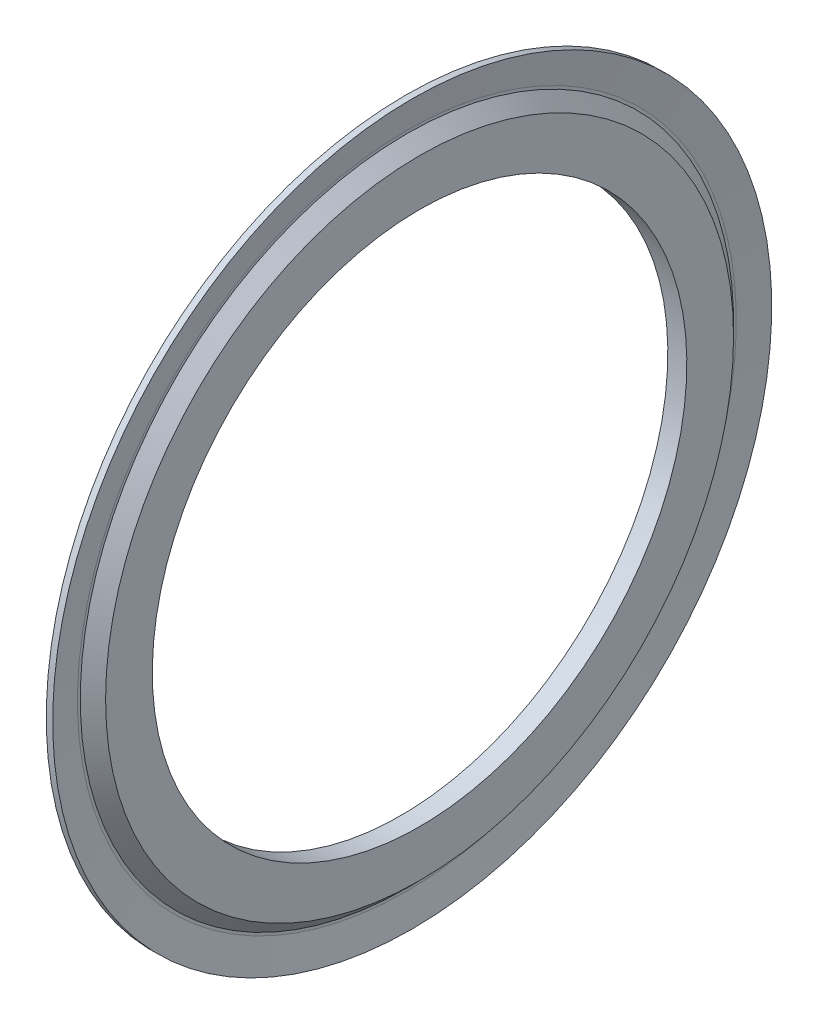
ISO-10303-21;
HEADER;
FILE_DESCRIPTION(('STEP AP214'),'2;1');
FILE_NAME('part.step','',(''),(''),'','','');
FILE_SCHEMA(('AUTOMOTIVE_DESIGN { 1 0 10303 214 1 1 1 1 }'));
ENDSEC;
DATA;
#1=APPLICATION_CONTEXT('core data for automotive mechanical design processes');
#2=APPLICATION_PROTOCOL_DEFINITION('international standard','automotive_design',2000,#1);
#3=PRODUCT_CONTEXT('',#1,'mechanical');
#4=PRODUCT('Part','Part','',(#3));
#5=PRODUCT_RELATED_PRODUCT_CATEGORY('part','',(#4));
#6=PRODUCT_DEFINITION_FORMATION('','',#4);
#7=PRODUCT_DEFINITION_CONTEXT('part definition',#1,'design');
#8=PRODUCT_DEFINITION('design','',#6,#7);
#9=PRODUCT_DEFINITION_SHAPE('','',#8);
#10=(LENGTH_UNIT() NAMED_UNIT(*) SI_UNIT(.MILLI.,.METRE.));
#11=(NAMED_UNIT(*) PLANE_ANGLE_UNIT() SI_UNIT($,.RADIAN.));
#12=(NAMED_UNIT(*) SI_UNIT($,.STERADIAN.) SOLID_ANGLE_UNIT());
#13=UNCERTAINTY_MEASURE_WITH_UNIT(LENGTH_MEASURE(1.E-05),#10,'distance_accuracy_value','');
#14=(GEOMETRIC_REPRESENTATION_CONTEXT(3) GLOBAL_UNCERTAINTY_ASSIGNED_CONTEXT((#13)) GLOBAL_UNIT_ASSIGNED_CONTEXT((#10,
#11,#12)) REPRESENTATION_CONTEXT('',''));
#15=CARTESIAN_POINT('',(0.,0.,0.));
#16=DIRECTION('',(0.,0.,1.));
#17=DIRECTION('',(1.,0.,0.));
#18=AXIS2_PLACEMENT_3D('',#15,#16,#17);
#19=CARTESIAN_POINT('',(2.67137851025326,4.335625,0.));
#20=DIRECTION('',(-1.,0.,0.));
#21=DIRECTION('',(0.,-1.,0.));
#22=AXIS2_PLACEMENT_3D('',#19,#20,#21);
#23=PLANE('',#22);
#24=CARTESIAN_POINT('',(2.67137851025326,0.,0.));
#25=DIRECTION('',(-1.,0.,0.));
#26=DIRECTION('',(0.,1.,0.));
#27=AXIS2_PLACEMENT_3D('',#24,#25,#26);
#28=CIRCLE('',#27,4.29625);
#29=CARTESIAN_POINT('',(2.67137851025326,4.29625,0.));
#30=VERTEX_POINT('',#29);
#31=EDGE_CURVE('E11',#30,#30,#28,.T.);
#32=ORIENTED_EDGE('',*,*,#31,.F.);
#33=EDGE_LOOP('',(#32));
#34=FACE_BOUND('',#33,.T.);
#35=CARTESIAN_POINT('',(2.67137851025326,0.,0.));
#36=DIRECTION('',(-1.,0.,0.));
#37=DIRECTION('',(0.,1.,0.));
#38=AXIS2_PLACEMENT_3D('',#35,#36,#37);
#39=CIRCLE('',#38,4.375);
#40=CARTESIAN_POINT('',(2.67137851025326,4.375,0.));
#41=VERTEX_POINT('',#40);
#42=EDGE_CURVE('E90',#41,#41,#39,.T.);
#43=ORIENTED_EDGE('',*,*,#42,.T.);
#44=EDGE_LOOP('',(#43));
#45=FACE_BOUND('',#44,.T.);
#46=ADVANCED_FACE('F37',(#34,#45),#23,.T.);
#47=CARTESIAN_POINT('',(2.75537851025326,0.,0.));
#48=DIRECTION('',(-1.,0.,0.));
#49=DIRECTION('',(0.,1.,0.));
#50=AXIS2_PLACEMENT_3D('',#47,#48,#49);
#51=CONICAL_SURFACE('',#50,4.21225,0.785398163397449);
#52=CARTESIAN_POINT('',(2.83937851025326,0.,0.));
#53=DIRECTION('',(-1.,0.,0.));
#54=DIRECTION('',(0.,1.,0.));
#55=AXIS2_PLACEMENT_3D('',#52,#53,#54);
#56=CIRCLE('',#55,4.12825);
#57=CARTESIAN_POINT('',(2.83937851025326,4.12825,0.));
#58=VERTEX_POINT('',#57);
#59=EDGE_CURVE('E47',#58,#58,#56,.T.);
#60=ORIENTED_EDGE('',*,*,#59,.F.);
#61=EDGE_LOOP('',(#60));
#62=FACE_BOUND('',#61,.T.);
#63=ORIENTED_EDGE('',*,*,#31,.T.);
#64=EDGE_LOOP('',(#63));
#65=FACE_BOUND('',#64,.T.);
#66=ADVANCED_FACE('F39',(#62,#65),#51,.F.);
#67=CARTESIAN_POINT('',(2.83937851025326,3.878,0.));
#68=DIRECTION('',(-1.,0.,0.));
#69=DIRECTION('',(0.,-1.,0.));
#70=AXIS2_PLACEMENT_3D('',#67,#68,#69);
#71=PLANE('',#70);
#72=CARTESIAN_POINT('',(2.83937851025326,0.,0.));
#73=DIRECTION('',(-1.,0.,0.));
#74=DIRECTION('',(0.,1.,0.));
#75=AXIS2_PLACEMENT_3D('',#72,#73,#74);
#76=CIRCLE('',#75,3.62775);
#77=CARTESIAN_POINT('',(2.83937851025326,3.62775,0.));
#78=VERTEX_POINT('',#77);
#79=EDGE_CURVE('E102',#78,#78,#76,.T.);
#80=ORIENTED_EDGE('',*,*,#79,.F.);
#81=EDGE_LOOP('',(#80));
#82=FACE_BOUND('',#81,.T.);
#83=ORIENTED_EDGE('',*,*,#59,.T.);
#84=EDGE_LOOP('',(#83));
#85=FACE_BOUND('',#84,.T.);
#86=ADVANCED_FACE('F134',(#82,#85),#71,.T.);
#87=CARTESIAN_POINT('',(2.75537851025326,0.,0.));
#88=DIRECTION('',(-1.,0.,0.));
#89=DIRECTION('',(0.,1.,0.));
#90=AXIS2_PLACEMENT_3D('',#87,#88,#89);
#91=CYLINDRICAL_SURFACE('',#90,3.62775);
#92=CARTESIAN_POINT('',(2.67137851025326,0.,0.));
#93=DIRECTION('',(-1.,0.,0.));
#94=DIRECTION('',(0.,1.,0.));
#95=AXIS2_PLACEMENT_3D('',#92,#93,#94);
#96=CIRCLE('',#95,3.62775);
#97=CARTESIAN_POINT('',(2.67137851025326,3.62775,0.));
#98=VERTEX_POINT('',#97);
#99=EDGE_CURVE('E103',#98,#98,#96,.T.);
#100=ORIENTED_EDGE('',*,*,#99,.F.);
#101=EDGE_LOOP('',(#100));
#102=FACE_BOUND('',#101,.T.);
#103=ORIENTED_EDGE('',*,*,#79,.T.);
#104=EDGE_LOOP('',(#103));
#105=FACE_BOUND('',#104,.T.);
#106=ADVANCED_FACE('F152',(#102,#105),#91,.T.);
#107=CARTESIAN_POINT('',(2.67137851025326,3.58575,0.));
#108=DIRECTION('',(-1.,0.,0.));
#109=DIRECTION('',(0.,-1.,0.));
#110=AXIS2_PLACEMENT_3D('',#107,#108,#109);
#111=PLANE('',#110);
#112=CARTESIAN_POINT('',(2.67137851025326,0.,0.));
#113=DIRECTION('',(-1.,0.,0.));
#114=DIRECTION('',(0.,1.,0.));
#115=AXIS2_PLACEMENT_3D('',#112,#113,#114);
#116=CIRCLE('',#115,3.54375);
#117=CARTESIAN_POINT('',(2.67137851025326,3.54375,0.));
#118=VERTEX_POINT('',#117);
#119=EDGE_CURVE('E106',#118,#118,#116,.T.);
#120=ORIENTED_EDGE('',*,*,#119,.F.);
#121=EDGE_LOOP('',(#120));
#122=FACE_BOUND('',#121,.T.);
#123=ORIENTED_EDGE('',*,*,#99,.T.);
#124=EDGE_LOOP('',(#123));
#125=FACE_BOUND('',#124,.T.);
#126=ADVANCED_FACE('F143',(#122,#125),#111,.T.);
#127=CARTESIAN_POINT('',(2.79737851025326,0.,0.));
#128=DIRECTION('',(-1.,0.,0.));
#129=DIRECTION('',(0.,1.,0.));
#130=AXIS2_PLACEMENT_3D('',#127,#128,#129);
#131=CYLINDRICAL_SURFACE('',#130,3.54375);
#132=CARTESIAN_POINT('',(2.92337851025326,0.,0.));
#133=DIRECTION('',(-1.,0.,0.));
#134=DIRECTION('',(0.,1.,0.));
#135=AXIS2_PLACEMENT_3D('',#132,#133,#134);
#136=CIRCLE('',#135,3.54375);
#137=CARTESIAN_POINT('',(2.92337851025326,3.54375,0.));
#138=VERTEX_POINT('',#137);
#139=EDGE_CURVE('E41',#138,#138,#136,.T.);
#140=ORIENTED_EDGE('',*,*,#139,.F.);
#141=EDGE_LOOP('',(#140));
#142=FACE_BOUND('',#141,.T.);
#143=ORIENTED_EDGE('',*,*,#119,.T.);
#144=EDGE_LOOP('',(#143));
#145=FACE_BOUND('',#144,.T.);
#146=ADVANCED_FACE('F138',(#142,#145),#131,.F.);
#147=CARTESIAN_POINT('',(2.92337851025326,3.85339696961967,0.));
#148=DIRECTION('',(1.,0.,0.));
#149=DIRECTION('',(0.,1.,0.));
#150=AXIS2_PLACEMENT_3D('',#147,#148,#149);
#151=PLANE('',#150);
#152=CARTESIAN_POINT('',(2.92337851025326,0.,0.));
#153=DIRECTION('',(-1.,0.,0.));
#154=DIRECTION('',(0.,1.,0.));
#155=AXIS2_PLACEMENT_3D('',#152,#153,#154);
#156=CIRCLE('',#155,4.16304393923934);
#157=CARTESIAN_POINT('',(2.92337851025326,4.16304393923934,0.));
#158=VERTEX_POINT('',#157);
#159=EDGE_CURVE('E64',#158,#158,#156,.T.);
#160=ORIENTED_EDGE('',*,*,#159,.F.);
#161=EDGE_LOOP('',(#160));
#162=FACE_BOUND('',#161,.T.);
#163=ORIENTED_EDGE('',*,*,#139,.T.);
#164=EDGE_LOOP('',(#163));
#165=FACE_BOUND('',#164,.T.);
#166=ADVANCED_FACE('F125',(#162,#165),#151,.T.);
#167=CARTESIAN_POINT('',(2.83937851025326,0.,0.));
#168=DIRECTION('',(-1.,0.,0.));
#169=DIRECTION('',(0.,1.,0.));
#170=AXIS2_PLACEMENT_3D('',#167,#168,#169);
#171=CONICAL_SURFACE('',#170,4.24704393923934,0.785398163397446);
#172=CARTESIAN_POINT('',(2.75537851025326,0.,0.));
#173=DIRECTION('',(-1.,0.,0.));
#174=DIRECTION('',(0.,1.,0.));
#175=AXIS2_PLACEMENT_3D('',#172,#173,#174);
#176=CIRCLE('',#175,4.33104393923934);
#177=CARTESIAN_POINT('',(2.75537851025326,4.33104393923934,0.));
#178=VERTEX_POINT('',#177);
#179=EDGE_CURVE('E70',#178,#178,#176,.T.);
#180=ORIENTED_EDGE('',*,*,#179,.F.);
#181=EDGE_LOOP('',(#180));
#182=FACE_BOUND('',#181,.T.);
#183=ORIENTED_EDGE('',*,*,#159,.T.);
#184=EDGE_LOOP('',(#183));
#185=FACE_BOUND('',#184,.T.);
#186=ADVANCED_FACE('F117',(#182,#185),#171,.T.);
#187=CARTESIAN_POINT('',(2.75537851025326,4.34934744575158,0.));
#188=DIRECTION('',(1.,0.,0.));
#189=DIRECTION('',(0.,1.,0.));
#190=AXIS2_PLACEMENT_3D('',#187,#188,#189);
#191=PLANE('',#190);
#192=CARTESIAN_POINT('',(2.75537851025326,0.,0.));
#193=DIRECTION('',(-1.,0.,0.));
#194=DIRECTION('',(0.,1.,0.));
#195=AXIS2_PLACEMENT_3D('',#192,#193,#194);
#196=CIRCLE('',#195,4.36765095226383);
#197=CARTESIAN_POINT('',(2.75537851025326,4.36765095226383,0.));
#198=VERTEX_POINT('',#197);
#199=EDGE_CURVE('E95',#198,#198,#196,.T.);
#200=ORIENTED_EDGE('',*,*,#199,.F.);
#201=EDGE_LOOP('',(#200));
#202=FACE_BOUND('',#201,.T.);
#203=ORIENTED_EDGE('',*,*,#179,.T.);
#204=EDGE_LOOP('',(#203));
#205=FACE_BOUND('',#204,.T.);
#206=ADVANCED_FACE('F115',(#202,#205),#191,.T.);
#207=CARTESIAN_POINT('',(2.79058651617132,0.,0.));
#208=DIRECTION('',(1.,0.,0.));
#209=DIRECTION('',(0.,1.,0.));
#210=AXIS2_PLACEMENT_3D('',#207,#208,#209);
#211=CONICAL_SURFACE('',#210,4.56732547613191,1.39626340159546);
#212=CARTESIAN_POINT('',(2.82579452208938,0.,0.));
#213=DIRECTION('',(-1.,0.,0.));
#214=DIRECTION('',(0.,1.,0.));
#215=AXIS2_PLACEMENT_3D('',#212,#213,#214);
#216=CIRCLE('',#215,4.767);
#217=CARTESIAN_POINT('',(2.82579452208938,4.767,0.));
#218=VERTEX_POINT('',#217);
#219=EDGE_CURVE('E92',#218,#218,#216,.T.);
#220=ORIENTED_EDGE('',*,*,#219,.F.);
#221=EDGE_LOOP('',(#220));
#222=FACE_BOUND('',#221,.T.);
#223=ORIENTED_EDGE('',*,*,#199,.T.);
#224=EDGE_LOOP('',(#223));
#225=FACE_BOUND('',#224,.T.);
#226=ADVANCED_FACE('F113',(#222,#225),#211,.F.);
#227=CARTESIAN_POINT('',(2.78314660439018,0.,0.));
#228=DIRECTION('',(-1.,0.,0.));
#229=DIRECTION('',(0.,1.,0.));
#230=AXIS2_PLACEMENT_3D('',#227,#228,#229);
#231=CYLINDRICAL_SURFACE('',#230,4.767);
#232=CARTESIAN_POINT('',(2.74049868669098,0.,0.));
#233=DIRECTION('',(-1.,0.,0.));
#234=DIRECTION('',(0.,1.,0.));
#235=AXIS2_PLACEMENT_3D('',#232,#233,#234);
#236=CIRCLE('',#235,4.767);
#237=CARTESIAN_POINT('',(2.74049868669098,4.767,0.));
#238=VERTEX_POINT('',#237);
#239=EDGE_CURVE('E93',#238,#238,#236,.T.);
#240=ORIENTED_EDGE('',*,*,#239,.F.);
#241=EDGE_LOOP('',(#240));
#242=FACE_BOUND('',#241,.T.);
#243=ORIENTED_EDGE('',*,*,#219,.T.);
#244=EDGE_LOOP('',(#243));
#245=FACE_BOUND('',#244,.T.);
#246=ADVANCED_FACE('F123',(#242,#245),#231,.T.);
#247=CARTESIAN_POINT('',(2.70593859847212,0.,0.));
#248=DIRECTION('',(1.,0.,0.));
#249=DIRECTION('',(0.,1.,0.));
#250=AXIS2_PLACEMENT_3D('',#247,#248,#249);
#251=CONICAL_SURFACE('',#250,4.571,1.39626340159546);
#252=ORIENTED_EDGE('',*,*,#42,.F.);
#253=EDGE_LOOP('',(#252));
#254=FACE_BOUND('',#253,.T.);
#255=ORIENTED_EDGE('',*,*,#239,.T.);
#256=EDGE_LOOP('',(#255));
#257=FACE_BOUND('',#256,.T.);
#258=ADVANCED_FACE('F163',(#254,#257),#251,.T.);
#259=CLOSED_SHELL('',(#46,#66,#86,#106,#126,#146,#166,#186,#206,#226,#246,#258));
#260=MANIFOLD_SOLID_BREP('B2',#259);
#261=ADVANCED_BREP_SHAPE_REPRESENTATION('',(#18,#260),#14);
#262=SHAPE_DEFINITION_REPRESENTATION(#9,#261);
ENDSEC;
END-ISO-10303-21;
